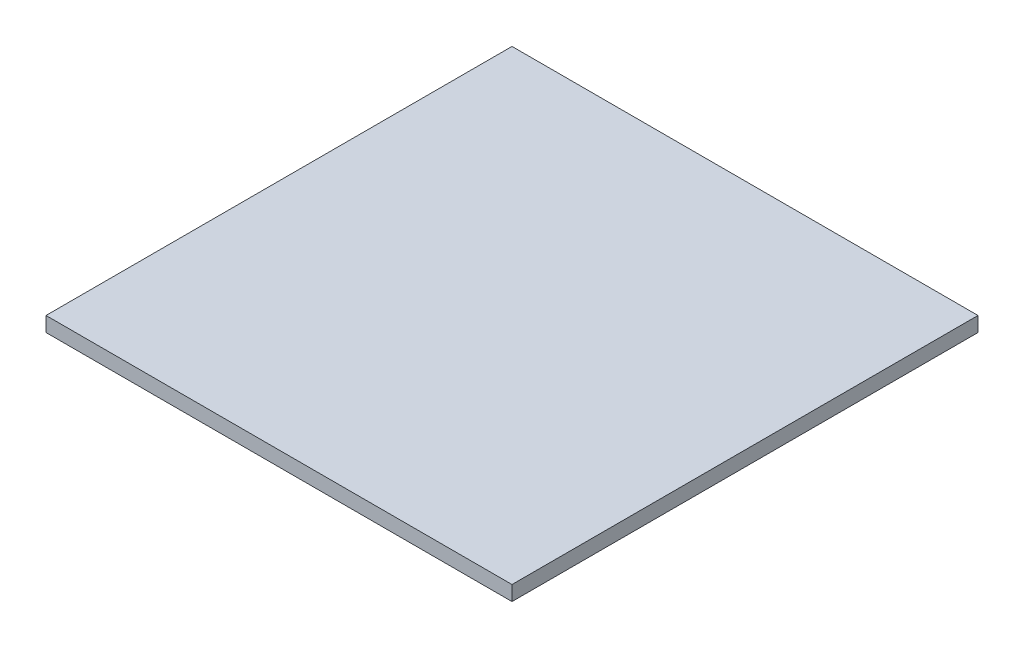
ISO-10303-21;
HEADER;
FILE_DESCRIPTION(('STEP AP214'),'2;1');
FILE_NAME('part.step','',(''),(''),'','','');
FILE_SCHEMA(('AUTOMOTIVE_DESIGN { 1 0 10303 214 1 1 1 1 }'));
ENDSEC;
DATA;
#1=APPLICATION_CONTEXT('core data for automotive mechanical design processes');
#2=APPLICATION_PROTOCOL_DEFINITION('international standard','automotive_design',2000,#1);
#3=PRODUCT_CONTEXT('',#1,'mechanical');
#4=PRODUCT('Part','Part','',(#3));
#5=PRODUCT_RELATED_PRODUCT_CATEGORY('part','',(#4));
#6=PRODUCT_DEFINITION_FORMATION('','',#4);
#7=PRODUCT_DEFINITION_CONTEXT('part definition',#1,'design');
#8=PRODUCT_DEFINITION('design','',#6,#7);
#9=PRODUCT_DEFINITION_SHAPE('','',#8);
#10=(LENGTH_UNIT() NAMED_UNIT(*) SI_UNIT(.MILLI.,.METRE.));
#11=(NAMED_UNIT(*) PLANE_ANGLE_UNIT() SI_UNIT($,.RADIAN.));
#12=(NAMED_UNIT(*) SI_UNIT($,.STERADIAN.) SOLID_ANGLE_UNIT());
#13=UNCERTAINTY_MEASURE_WITH_UNIT(LENGTH_MEASURE(1.E-05),#10,'distance_accuracy_value','');
#14=(GEOMETRIC_REPRESENTATION_CONTEXT(3) GLOBAL_UNCERTAINTY_ASSIGNED_CONTEXT((#13)) GLOBAL_UNIT_ASSIGNED_CONTEXT((#10,
#11,#12)) REPRESENTATION_CONTEXT('',''));
#15=CARTESIAN_POINT('',(0.,0.,0.));
#16=DIRECTION('',(0.,0.,1.));
#17=DIRECTION('',(1.,0.,0.));
#18=AXIS2_PLACEMENT_3D('',#15,#16,#17);
#19=CARTESIAN_POINT('',(50.,3.175,50.));
#20=DIRECTION('',(-1.,0.,0.));
#21=DIRECTION('',(0.,0.,1.));
#22=AXIS2_PLACEMENT_3D('',#19,#20,#21);
#23=PLANE('',#22);
#24=DIRECTION('',(0.,0.,-1.));
#25=VECTOR('',#24,1.);
#26=CARTESIAN_POINT('',(50.,0.,50.));
#27=LINE('',#26,#25);
#28=CARTESIAN_POINT('',(50.,0.,50.));
#29=VERTEX_POINT('',#28);
#30=CARTESIAN_POINT('',(50.,0.,-50.));
#31=VERTEX_POINT('',#30);
#32=EDGE_CURVE('E97',#29,#31,#27,.T.);
#33=ORIENTED_EDGE('',*,*,#32,.T.);
#34=DIRECTION('',(0.,-1.,0.));
#35=VECTOR('',#34,1.);
#36=CARTESIAN_POINT('',(50.,3.175,-50.));
#37=LINE('',#36,#35);
#38=CARTESIAN_POINT('',(50.,3.175,-50.));
#39=VERTEX_POINT('',#38);
#40=EDGE_CURVE('E11',#39,#31,#37,.T.);
#41=ORIENTED_EDGE('',*,*,#40,.F.);
#42=DIRECTION('',(0.,0.,-1.));
#43=VECTOR('',#42,1.);
#44=CARTESIAN_POINT('',(50.,3.175,50.));
#45=LINE('',#44,#43);
#46=CARTESIAN_POINT('',(50.,3.175,50.));
#47=VERTEX_POINT('',#46);
#48=EDGE_CURVE('E85',#47,#39,#45,.T.);
#49=ORIENTED_EDGE('',*,*,#48,.F.);
#50=DIRECTION('',(0.,-1.,0.));
#51=VECTOR('',#50,1.);
#52=CARTESIAN_POINT('',(50.,3.175,50.));
#53=LINE('',#52,#51);
#54=EDGE_CURVE('E93',#47,#29,#53,.T.);
#55=ORIENTED_EDGE('',*,*,#54,.T.);
#56=EDGE_LOOP('',(#33,#41,#49,#55));
#57=FACE_BOUND('',#56,.T.);
#58=ADVANCED_FACE('F34',(#57),#23,.F.);
#59=CARTESIAN_POINT('',(-50.,3.175,-50.));
#60=DIRECTION('',(0.,0.,1.));
#61=DIRECTION('',(1.,0.,0.));
#62=AXIS2_PLACEMENT_3D('',#59,#60,#61);
#63=PLANE('',#62);
#64=DIRECTION('',(-1.,0.,0.));
#65=VECTOR('',#64,1.);
#66=CARTESIAN_POINT('',(-50.,0.,-50.));
#67=LINE('',#66,#65);
#68=CARTESIAN_POINT('',(-50.,0.,-50.));
#69=VERTEX_POINT('',#68);
#70=EDGE_CURVE('E89',#31,#69,#67,.T.);
#71=ORIENTED_EDGE('',*,*,#70,.T.);
#72=DIRECTION('',(0.,-1.,0.));
#73=VECTOR('',#72,1.);
#74=CARTESIAN_POINT('',(-50.,3.175,-50.));
#75=LINE('',#74,#73);
#76=CARTESIAN_POINT('',(-50.,3.175,-50.));
#77=VERTEX_POINT('',#76);
#78=EDGE_CURVE('E42',#77,#69,#75,.T.);
#79=ORIENTED_EDGE('',*,*,#78,.F.);
#80=DIRECTION('',(-1.,0.,0.));
#81=VECTOR('',#80,1.);
#82=CARTESIAN_POINT('',(-50.,3.175,-50.));
#83=LINE('',#82,#81);
#84=EDGE_CURVE('E80',#39,#77,#83,.T.);
#85=ORIENTED_EDGE('',*,*,#84,.F.);
#86=ORIENTED_EDGE('',*,*,#40,.T.);
#87=EDGE_LOOP('',(#71,#79,#85,#86));
#88=FACE_BOUND('',#87,.T.);
#89=ADVANCED_FACE('F88',(#88),#63,.F.);
#90=CARTESIAN_POINT('',(-50.,3.175,50.));
#91=DIRECTION('',(1.,0.,0.));
#92=DIRECTION('',(0.,0.,-1.));
#93=AXIS2_PLACEMENT_3D('',#90,#91,#92);
#94=PLANE('',#93);
#95=DIRECTION('',(0.,0.,1.));
#96=VECTOR('',#95,1.);
#97=CARTESIAN_POINT('',(-50.,0.,50.));
#98=LINE('',#97,#96);
#99=CARTESIAN_POINT('',(-50.,0.,50.));
#100=VERTEX_POINT('',#99);
#101=EDGE_CURVE('E67',#69,#100,#98,.T.);
#102=ORIENTED_EDGE('',*,*,#101,.T.);
#103=DIRECTION('',(0.,-1.,0.));
#104=VECTOR('',#103,1.);
#105=CARTESIAN_POINT('',(-50.,3.175,50.));
#106=LINE('',#105,#104);
#107=CARTESIAN_POINT('',(-50.,3.175,50.));
#108=VERTEX_POINT('',#107);
#109=EDGE_CURVE('E90',#108,#100,#106,.T.);
#110=ORIENTED_EDGE('',*,*,#109,.F.);
#111=DIRECTION('',(0.,0.,1.));
#112=VECTOR('',#111,1.);
#113=CARTESIAN_POINT('',(-50.,3.175,50.));
#114=LINE('',#113,#112);
#115=EDGE_CURVE('E83',#77,#108,#114,.T.);
#116=ORIENTED_EDGE('',*,*,#115,.F.);
#117=ORIENTED_EDGE('',*,*,#78,.T.);
#118=EDGE_LOOP('',(#102,#110,#116,#117));
#119=FACE_BOUND('',#118,.T.);
#120=ADVANCED_FACE('F91',(#119),#94,.F.);
#121=CARTESIAN_POINT('',(-50.,3.175,50.));
#122=DIRECTION('',(0.,0.,-1.));
#123=DIRECTION('',(-1.,0.,0.));
#124=AXIS2_PLACEMENT_3D('',#121,#122,#123);
#125=PLANE('',#124);
#126=DIRECTION('',(1.,0.,0.));
#127=VECTOR('',#126,1.);
#128=CARTESIAN_POINT('',(-50.,0.,50.));
#129=LINE('',#128,#127);
#130=EDGE_CURVE('E73',#100,#29,#129,.T.);
#131=ORIENTED_EDGE('',*,*,#130,.T.);
#132=ORIENTED_EDGE('',*,*,#54,.F.);
#133=DIRECTION('',(1.,0.,0.));
#134=VECTOR('',#133,1.);
#135=CARTESIAN_POINT('',(-50.,3.175,50.));
#136=LINE('',#135,#134);
#137=EDGE_CURVE('E50',#108,#47,#136,.T.);
#138=ORIENTED_EDGE('',*,*,#137,.F.);
#139=ORIENTED_EDGE('',*,*,#109,.T.);
#140=EDGE_LOOP('',(#131,#132,#138,#139));
#141=FACE_BOUND('',#140,.T.);
#142=ADVANCED_FACE('F104',(#141),#125,.F.);
#143=CARTESIAN_POINT('',(0.,3.175,0.));
#144=DIRECTION('',(0.,-1.,0.));
#145=DIRECTION('',(0.,0.,-1.));
#146=AXIS2_PLACEMENT_3D('',#143,#144,#145);
#147=PLANE('',#146);
#148=ORIENTED_EDGE('',*,*,#48,.T.);
#149=ORIENTED_EDGE('',*,*,#84,.T.);
#150=ORIENTED_EDGE('',*,*,#115,.T.);
#151=ORIENTED_EDGE('',*,*,#137,.T.);
#152=EDGE_LOOP('',(#148,#149,#150,#151));
#153=FACE_BOUND('',#152,.T.);
#154=ADVANCED_FACE('F81',(#153),#147,.F.);
#155=CARTESIAN_POINT('',(0.,0.,0.));
#156=DIRECTION('',(0.,-1.,0.));
#157=DIRECTION('',(0.,0.,-1.));
#158=AXIS2_PLACEMENT_3D('',#155,#156,#157);
#159=PLANE('',#158);
#160=ORIENTED_EDGE('',*,*,#32,.F.);
#161=ORIENTED_EDGE('',*,*,#130,.F.);
#162=ORIENTED_EDGE('',*,*,#101,.F.);
#163=ORIENTED_EDGE('',*,*,#70,.F.);
#164=EDGE_LOOP('',(#160,#161,#162,#163));
#165=FACE_BOUND('',#164,.T.);
#166=ADVANCED_FACE('F107',(#165),#159,.T.);
#167=CLOSED_SHELL('',(#58,#89,#120,#142,#154,#166));
#168=MANIFOLD_SOLID_BREP('B2',#167);
#169=ADVANCED_BREP_SHAPE_REPRESENTATION('',(#18,#168),#14);
#170=SHAPE_DEFINITION_REPRESENTATION(#9,#169);
ENDSEC;
END-ISO-10303-21;
